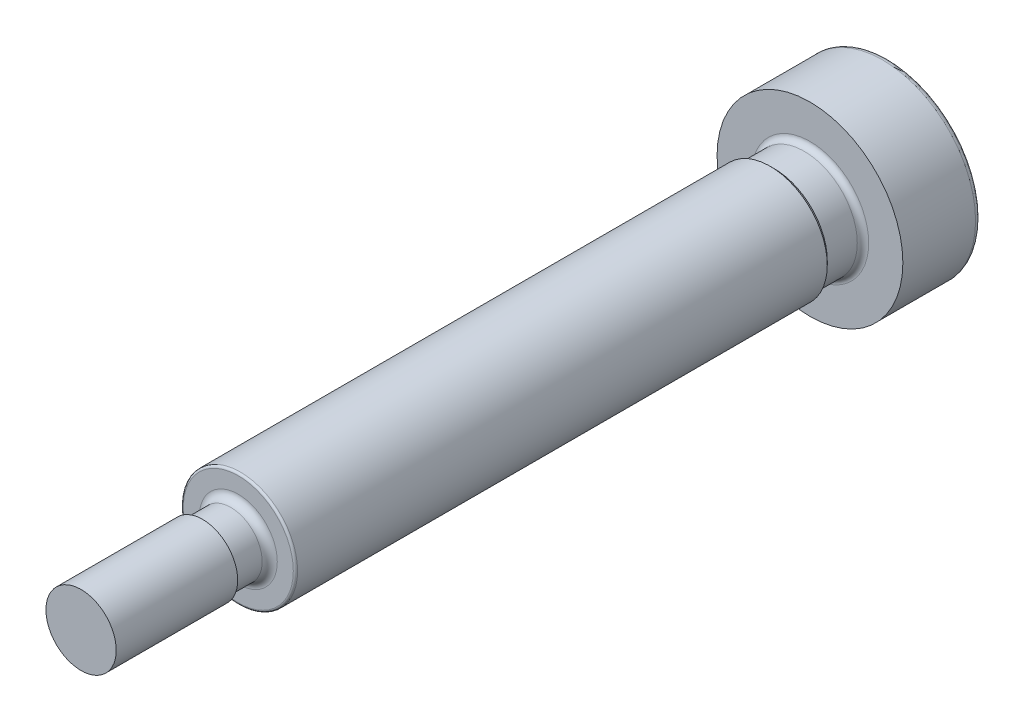
ISO-10303-21;
HEADER;
FILE_DESCRIPTION(('STEP AP214'),'2;1');
FILE_NAME('part.step','',(''),(''),'','','');
FILE_SCHEMA(('AUTOMOTIVE_DESIGN { 1 0 10303 214 1 1 1 1 }'));
ENDSEC;
DATA;
#1=APPLICATION_CONTEXT('core data for automotive mechanical design processes');
#2=APPLICATION_PROTOCOL_DEFINITION('international standard','automotive_design',2000,#1);
#3=PRODUCT_CONTEXT('',#1,'mechanical');
#4=PRODUCT('Part','Part','',(#3));
#5=PRODUCT_RELATED_PRODUCT_CATEGORY('part','',(#4));
#6=PRODUCT_DEFINITION_FORMATION('','',#4);
#7=PRODUCT_DEFINITION_CONTEXT('part definition',#1,'design');
#8=PRODUCT_DEFINITION('design','',#6,#7);
#9=PRODUCT_DEFINITION_SHAPE('','',#8);
#10=(LENGTH_UNIT() NAMED_UNIT(*) SI_UNIT(.MILLI.,.METRE.));
#11=(NAMED_UNIT(*) PLANE_ANGLE_UNIT() SI_UNIT($,.RADIAN.));
#12=(NAMED_UNIT(*) SI_UNIT($,.STERADIAN.) SOLID_ANGLE_UNIT());
#13=UNCERTAINTY_MEASURE_WITH_UNIT(LENGTH_MEASURE(1.E-05),#10,'distance_accuracy_value','');
#14=(GEOMETRIC_REPRESENTATION_CONTEXT(3) GLOBAL_UNCERTAINTY_ASSIGNED_CONTEXT((#13)) GLOBAL_UNIT_ASSIGNED_CONTEXT((#10,
#11,#12)) REPRESENTATION_CONTEXT('',''));
#15=CARTESIAN_POINT('',(0.,0.,0.));
#16=DIRECTION('',(0.,0.,1.));
#17=DIRECTION('',(1.,0.,0.));
#18=AXIS2_PLACEMENT_3D('',#15,#16,#17);
#19=CARTESIAN_POINT('',(0.,0.,-309.));
#20=DIRECTION('',(0.,0.,-1.));
#21=DIRECTION('',(0.,-1.,0.));
#22=AXIS2_PLACEMENT_3D('',#19,#20,#21);
#23=PLANE('',#22);
#24=CARTESIAN_POINT('',(0.,0.,-309.));
#25=DIRECTION('',(0.,0.,1.));
#26=DIRECTION('',(1.,0.,0.));
#27=AXIS2_PLACEMENT_3D('',#24,#25,#26);
#28=CIRCLE('',#27,2.458734122635);
#29=CARTESIAN_POINT('',(2.458734122635,0.,-309.));
#30=VERTEX_POINT('',#29);
#31=EDGE_CURVE('E11',#30,#30,#28,.T.);
#32=ORIENTED_EDGE('',*,*,#31,.T.);
#33=EDGE_LOOP('',(#32));
#34=FACE_BOUND('',#33,.T.);
#35=ADVANCED_FACE('F16',(#34),#23,.F.);
#36=CARTESIAN_POINT('',(0.,0.,-309.));
#37=DIRECTION('',(0.,0.,-1.));
#38=DIRECTION('',(1.,0.,0.));
#39=AXIS2_PLACEMENT_3D('',#36,#37,#38);
#40=CYLINDRICAL_SURFACE('',#39,2.458734122635);
#41=DIRECTION('',(0.,0.,-1.));
#42=VECTOR('',#41,1.);
#43=CARTESIAN_POINT('',(2.458734122635,0.,-309.));
#44=LINE('',#43,#42);
#45=CARTESIAN_POINT('',(2.458734122635,0.,-317.5));
#46=VERTEX_POINT('',#45);
#47=EDGE_CURVE('E26',#30,#46,#44,.T.);
#48=ORIENTED_EDGE('',*,*,#47,.F.);
#49=ORIENTED_EDGE('',*,*,#31,.F.);
#50=ORIENTED_EDGE('',*,*,#47,.T.);
#51=CARTESIAN_POINT('',(0.,0.,-317.5));
#52=DIRECTION('',(0.,0.,1.));
#53=DIRECTION('',(1.,0.,0.));
#54=AXIS2_PLACEMENT_3D('',#51,#52,#53);
#55=CIRCLE('',#54,2.458734122635);
#56=EDGE_CURVE('E221',#46,#46,#55,.T.);
#57=ORIENTED_EDGE('',*,*,#56,.T.);
#58=EDGE_LOOP('',(#48,#49,#50,#57));
#59=FACE_BOUND('',#58,.T.);
#60=ADVANCED_FACE('F472',(#59),#40,.T.);
#61=CARTESIAN_POINT('',(0.,0.,-317.5));
#62=DIRECTION('',(0.,0.,-1.));
#63=DIRECTION('',(0.,-1.,0.));
#64=AXIS2_PLACEMENT_3D('',#61,#62,#63);
#65=PLANE('',#64);
#66=CARTESIAN_POINT('',(0.,0.,-317.5));
#67=DIRECTION('',(0.,0.,1.));
#68=DIRECTION('',(1.,0.,0.));
#69=AXIS2_PLACEMENT_3D('',#66,#67,#68);
#70=CIRCLE('',#69,2.2);
#71=CARTESIAN_POINT('',(2.2,0.,-317.5));
#72=VERTEX_POINT('',#71);
#73=EDGE_CURVE('E19',#72,#72,#70,.T.);
#74=ORIENTED_EDGE('',*,*,#73,.T.);
#75=EDGE_LOOP('',(#74));
#76=FACE_BOUND('',#75,.T.);
#77=ORIENTED_EDGE('',*,*,#56,.F.);
#78=EDGE_LOOP('',(#77));
#79=FACE_BOUND('',#78,.T.);
#80=ADVANCED_FACE('F464',(#76,#79),#65,.T.);
#81=CARTESIAN_POINT('',(0.,0.,-320.));
#82=DIRECTION('',(0.,0.,1.));
#83=DIRECTION('',(1.,0.,0.));
#84=AXIS2_PLACEMENT_3D('',#81,#82,#83);
#85=CYLINDRICAL_SURFACE('',#84,2.2);
#86=CARTESIAN_POINT('',(0.,0.,-319.47));
#87=DIRECTION('',(0.,0.,1.));
#88=DIRECTION('',(1.,0.,0.));
#89=AXIS2_PLACEMENT_3D('',#86,#87,#88);
#90=CIRCLE('',#89,2.2);
#91=CARTESIAN_POINT('',(2.2,0.,-319.47));
#92=VERTEX_POINT('',#91);
#93=EDGE_CURVE('E289',#92,#92,#90,.T.);
#94=ORIENTED_EDGE('',*,*,#93,.T.);
#95=DIRECTION('',(0.,0.,1.));
#96=VECTOR('',#95,1.);
#97=CARTESIAN_POINT('',(2.2,0.,-320.));
#98=LINE('',#97,#96);
#99=EDGE_CURVE('E103',#92,#72,#98,.T.);
#100=ORIENTED_EDGE('',*,*,#99,.T.);
#101=ORIENTED_EDGE('',*,*,#73,.F.);
#102=ORIENTED_EDGE('',*,*,#99,.F.);
#103=EDGE_LOOP('',(#94,#100,#101,#102));
#104=FACE_BOUND('',#103,.T.);
#105=ADVANCED_FACE('F455',(#104),#85,.T.);
#106=CARTESIAN_POINT('',(0.,0.,-319.47));
#107=DIRECTION('',(0.,0.,1.));
#108=DIRECTION('',(1.,0.,0.));
#109=AXIS2_PLACEMENT_3D('',#106,#107,#108);
#110=TOROIDAL_SURFACE('',#109,2.73,0.53);
#111=CARTESIAN_POINT('',(2.73,0.,-319.47));
#112=DIRECTION('',(0.,-1.,0.));
#113=DIRECTION('',(-1.,0.,0.));
#114=AXIS2_PLACEMENT_3D('',#111,#112,#113);
#115=CIRCLE('',#114,0.53);
#116=CARTESIAN_POINT('',(2.73,0.,-320.));
#117=VERTEX_POINT('',#116);
#118=EDGE_CURVE('E286',#92,#117,#115,.T.);
#119=ORIENTED_EDGE('',*,*,#118,.T.);
#120=CARTESIAN_POINT('',(0.,0.,-320.));
#121=DIRECTION('',(0.,0.,1.));
#122=DIRECTION('',(1.,0.,0.));
#123=AXIS2_PLACEMENT_3D('',#120,#121,#122);
#124=CIRCLE('',#123,2.73);
#125=EDGE_CURVE('E290',#117,#117,#124,.T.);
#126=ORIENTED_EDGE('',*,*,#125,.T.);
#127=ORIENTED_EDGE('',*,*,#118,.F.);
#128=ORIENTED_EDGE('',*,*,#93,.F.);
#129=EDGE_LOOP('',(#119,#126,#127,#128));
#130=FACE_BOUND('',#129,.T.);
#131=ADVANCED_FACE('F446',(#130),#110,.F.);
#132=CARTESIAN_POINT('',(0.,0.,-320.));
#133=DIRECTION('',(0.,0.,-1.));
#134=DIRECTION('',(0.,-1.,0.));
#135=AXIS2_PLACEMENT_3D('',#132,#133,#134);
#136=PLANE('',#135);
#137=ORIENTED_EDGE('',*,*,#125,.F.);
#138=EDGE_LOOP('',(#137));
#139=FACE_BOUND('',#138,.T.);
#140=CARTESIAN_POINT('',(0.,0.,-320.));
#141=DIRECTION('',(0.,0.,1.));
#142=DIRECTION('',(1.,0.,0.));
#143=AXIS2_PLACEMENT_3D('',#140,#141,#142);
#144=CIRCLE('',#143,3.85);
#145=CARTESIAN_POINT('',(3.85,0.,-320.));
#146=VERTEX_POINT('',#145);
#147=EDGE_CURVE('E285',#146,#146,#144,.T.);
#148=ORIENTED_EDGE('',*,*,#147,.T.);
#149=EDGE_LOOP('',(#148));
#150=FACE_BOUND('',#149,.T.);
#151=ADVANCED_FACE('F437',(#139,#150),#136,.F.);
#152=CARTESIAN_POINT('',(0.,0.,-320.15));
#153=DIRECTION('',(0.,0.,1.));
#154=DIRECTION('',(1.,0.,0.));
#155=AXIS2_PLACEMENT_3D('',#152,#153,#154);
#156=TOROIDAL_SURFACE('',#155,3.85,0.15);
#157=CARTESIAN_POINT('',(0.,0.,-320.15));
#158=DIRECTION('',(0.,0.,1.));
#159=DIRECTION('',(1.,0.,0.));
#160=AXIS2_PLACEMENT_3D('',#157,#158,#159);
#161=CIRCLE('',#160,4.);
#162=CARTESIAN_POINT('',(4.,0.,-320.15));
#163=VERTEX_POINT('',#162);
#164=EDGE_CURVE('E277',#163,#163,#161,.T.);
#165=ORIENTED_EDGE('',*,*,#164,.T.);
#166=CARTESIAN_POINT('',(3.85,0.,-320.15));
#167=DIRECTION('',(0.,-1.,0.));
#168=DIRECTION('',(-1.,0.,0.));
#169=AXIS2_PLACEMENT_3D('',#166,#167,#168);
#170=CIRCLE('',#169,0.15);
#171=EDGE_CURVE('E280',#163,#146,#170,.T.);
#172=ORIENTED_EDGE('',*,*,#171,.T.);
#173=ORIENTED_EDGE('',*,*,#147,.F.);
#174=ORIENTED_EDGE('',*,*,#171,.F.);
#175=EDGE_LOOP('',(#165,#172,#173,#174));
#176=FACE_BOUND('',#175,.T.);
#177=ADVANCED_FACE('F428',(#176),#156,.T.);
#178=CARTESIAN_POINT('',(2.309401076759,0.,-362.2));
#179=DIRECTION('',(0.,0.,1.));
#180=DIRECTION('',(0.,-1.,0.));
#181=AXIS2_PLACEMENT_3D('',#178,#179,#180);
#182=PLANE('',#181);
#183=DIRECTION('',(0.50000000000019,0.866025403784329,0.));
#184=VECTOR('',#183,1.);
#185=CARTESIAN_POINT('',(1.154700538379,-2.,-362.2));
#186=LINE('',#185,#184);
#187=CARTESIAN_POINT('',(1.154700538379,-2.,-362.2));
#188=VERTEX_POINT('',#187);
#189=CARTESIAN_POINT('',(2.309401076759,0.,-362.2));
#190=VERTEX_POINT('',#189);
#191=EDGE_CURVE('E136',#188,#190,#186,.T.);
#192=ORIENTED_EDGE('',*,*,#191,.F.);
#193=DIRECTION('',(1.,0.,0.));
#194=VECTOR('',#193,1.);
#195=CARTESIAN_POINT('',(-1.154700538379,-2.,-362.2));
#196=LINE('',#195,#194);
#197=CARTESIAN_POINT('',(-1.154700538379,-2.,-362.2));
#198=VERTEX_POINT('',#197);
#199=EDGE_CURVE('E130',#198,#188,#196,.T.);
#200=ORIENTED_EDGE('',*,*,#199,.F.);
#201=DIRECTION('',(0.50000000000019,-0.866025403784329,0.));
#202=VECTOR('',#201,1.);
#203=CARTESIAN_POINT('',(-2.309401076759,0.,-362.2));
#204=LINE('',#203,#202);
#205=CARTESIAN_POINT('',(-2.309401076759,0.,-362.2));
#206=VERTEX_POINT('',#205);
#207=EDGE_CURVE('E212',#206,#198,#204,.T.);
#208=ORIENTED_EDGE('',*,*,#207,.F.);
#209=DIRECTION('',(-0.50000000000019,-0.866025403784329,0.));
#210=VECTOR('',#209,1.);
#211=CARTESIAN_POINT('',(-1.154700538379,2.,-362.2));
#212=LINE('',#211,#210);
#213=CARTESIAN_POINT('',(-1.154700538379,2.,-362.2));
#214=VERTEX_POINT('',#213);
#215=EDGE_CURVE('E254',#214,#206,#212,.T.);
#216=ORIENTED_EDGE('',*,*,#215,.F.);
#217=DIRECTION('',(-1.,0.,0.));
#218=VECTOR('',#217,1.);
#219=CARTESIAN_POINT('',(1.154700538379,2.,-362.2));
#220=LINE('',#219,#218);
#221=CARTESIAN_POINT('',(1.154700538379,2.,-362.2));
#222=VERTEX_POINT('',#221);
#223=EDGE_CURVE('E266',#222,#214,#220,.T.);
#224=ORIENTED_EDGE('',*,*,#223,.F.);
#225=DIRECTION('',(-0.50000000000019,0.866025403784329,0.));
#226=VECTOR('',#225,1.);
#227=CARTESIAN_POINT('',(2.309401076759,0.,-362.2));
#228=LINE('',#227,#226);
#229=EDGE_CURVE('E272',#190,#222,#228,.T.);
#230=ORIENTED_EDGE('',*,*,#229,.F.);
#231=EDGE_LOOP('',(#192,#200,#208,#216,#224,#230));
#232=FACE_BOUND('',#231,.T.);
#233=ADVANCED_FACE('F419',(#232),#182,.F.);
#234=CARTESIAN_POINT('',(0.,0.,-357.21));
#235=DIRECTION('',(0.,0.,1.));
#236=DIRECTION('',(1.,0.,0.));
#237=AXIS2_PLACEMENT_3D('',#234,#235,#236);
#238=CYLINDRICAL_SURFACE('',#237,4.);
#239=CARTESIAN_POINT('',(0.,0.,-357.21));
#240=DIRECTION('',(0.,0.,1.));
#241=DIRECTION('',(1.,0.,0.));
#242=AXIS2_PLACEMENT_3D('',#239,#240,#241);
#243=CIRCLE('',#242,4.);
#244=CARTESIAN_POINT('',(4.,0.,-357.21));
#245=VERTEX_POINT('',#244);
#246=EDGE_CURVE('E137',#245,#245,#243,.T.);
#247=ORIENTED_EDGE('',*,*,#246,.T.);
#248=DIRECTION('',(0.,0.,1.));
#249=VECTOR('',#248,1.);
#250=CARTESIAN_POINT('',(4.,0.,-357.21));
#251=LINE('',#250,#249);
#252=EDGE_CURVE('E273',#245,#163,#251,.T.);
#253=ORIENTED_EDGE('',*,*,#252,.T.);
#254=ORIENTED_EDGE('',*,*,#164,.F.);
#255=ORIENTED_EDGE('',*,*,#252,.F.);
#256=EDGE_LOOP('',(#247,#253,#254,#255));
#257=FACE_BOUND('',#256,.T.);
#258=ADVANCED_FACE('F410',(#257),#238,.T.);
#259=CARTESIAN_POINT('',(2.309401076759,0.,-362.2));
#260=DIRECTION('',(-0.866025403784329,-0.50000000000019,0.));
#261=DIRECTION('',(-0.50000000000019,0.866025403784329,0.));
#262=AXIS2_PLACEMENT_3D('',#259,#260,#261);
#263=PLANE('',#262);
#264=CARTESIAN_POINT('',(2.309401076759,0.,-365.5));
#265=CARTESIAN_POINT('',(2.309401076759,0.,-362.2));
#266=(BOUNDED_CURVE() B_SPLINE_CURVE(1,(#264,#265),.UNSPECIFIED.,.F.,
.F.) B_SPLINE_CURVE_WITH_KNOTS((2,2),(0.,1.),
.UNSPECIFIED.) CURVE() GEOMETRIC_REPRESENTATION_ITEM() RATIONAL_B_SPLINE_CURVE((1.,1.)) REPRESENTATION_ITEM(''));
#267=CARTESIAN_POINT('',(2.309401076759,0.,-365.5));
#268=VERTEX_POINT('',#267);
#269=EDGE_CURVE('E153',#268,#190,#266,.T.);
#270=ORIENTED_EDGE('',*,*,#269,.T.);
#271=ORIENTED_EDGE('',*,*,#229,.T.);
#272=CARTESIAN_POINT('',(1.154700538379,2.,-365.5));
#273=CARTESIAN_POINT('',(1.154700538379,2.,-362.2));
#274=(BOUNDED_CURVE() B_SPLINE_CURVE(1,(#272,#273),.UNSPECIFIED.,.F.,
.F.) B_SPLINE_CURVE_WITH_KNOTS((2,2),(0.,1.),
.UNSPECIFIED.) CURVE() GEOMETRIC_REPRESENTATION_ITEM() RATIONAL_B_SPLINE_CURVE((1.,1.)) REPRESENTATION_ITEM(''));
#275=CARTESIAN_POINT('',(1.154700538379,2.,-365.5));
#276=VERTEX_POINT('',#275);
#277=EDGE_CURVE('E260',#276,#222,#274,.T.);
#278=ORIENTED_EDGE('',*,*,#277,.F.);
#279=DIRECTION('',(-0.50000000000019,0.866025403784329,0.));
#280=VECTOR('',#279,1.);
#281=CARTESIAN_POINT('',(2.309401076759,0.,-365.5));
#282=LINE('',#281,#280);
#283=EDGE_CURVE('E156',#268,#276,#282,.T.);
#284=ORIENTED_EDGE('',*,*,#283,.F.);
#285=EDGE_LOOP('',(#270,#271,#278,#284));
#286=FACE_BOUND('',#285,.T.);
#287=ADVANCED_FACE('F401',(#286),#263,.T.);
#288=CARTESIAN_POINT('',(1.154700538379,2.,-362.2));
#289=DIRECTION('',(0.,-1.,0.));
#290=DIRECTION('',(-1.,0.,0.));
#291=AXIS2_PLACEMENT_3D('',#288,#289,#290);
#292=PLANE('',#291);
#293=ORIENTED_EDGE('',*,*,#277,.T.);
#294=ORIENTED_EDGE('',*,*,#223,.T.);
#295=CARTESIAN_POINT('',(-1.154700538379,2.,-365.5));
#296=CARTESIAN_POINT('',(-1.154700538379,2.,-362.2));
#297=(BOUNDED_CURVE() B_SPLINE_CURVE(1,(#295,#296),.UNSPECIFIED.,.F.,
.F.) B_SPLINE_CURVE_WITH_KNOTS((2,2),(0.,1.),
.UNSPECIFIED.) CURVE() GEOMETRIC_REPRESENTATION_ITEM() RATIONAL_B_SPLINE_CURVE((1.,1.)) REPRESENTATION_ITEM(''));
#298=CARTESIAN_POINT('',(-1.154700538379,2.,-365.5));
#299=VERTEX_POINT('',#298);
#300=EDGE_CURVE('E215',#299,#214,#297,.T.);
#301=ORIENTED_EDGE('',*,*,#300,.F.);
#302=DIRECTION('',(-1.,0.,0.));
#303=VECTOR('',#302,1.);
#304=CARTESIAN_POINT('',(1.154700538379,2.,-365.5));
#305=LINE('',#304,#303);
#306=EDGE_CURVE('E163',#276,#299,#305,.T.);
#307=ORIENTED_EDGE('',*,*,#306,.F.);
#308=EDGE_LOOP('',(#293,#294,#301,#307));
#309=FACE_BOUND('',#308,.T.);
#310=ADVANCED_FACE('F384',(#309),#292,.T.);
#311=CARTESIAN_POINT('',(-1.154700538379,2.,-362.2));
#312=DIRECTION('',(0.866025403784329,-0.50000000000019,0.));
#313=DIRECTION('',(0.,0.,-1.));
#314=AXIS2_PLACEMENT_3D('',#311,#312,#313);
#315=PLANE('',#314);
#316=ORIENTED_EDGE('',*,*,#300,.T.);
#317=ORIENTED_EDGE('',*,*,#215,.T.);
#318=CARTESIAN_POINT('',(-2.309401076759,0.,-365.5));
#319=CARTESIAN_POINT('',(-2.309401076759,0.,-362.2));
#320=(BOUNDED_CURVE() B_SPLINE_CURVE(1,(#318,#319),.UNSPECIFIED.,.F.,
.F.) B_SPLINE_CURVE_WITH_KNOTS((2,2),(0.,1.),
.UNSPECIFIED.) CURVE() GEOMETRIC_REPRESENTATION_ITEM() RATIONAL_B_SPLINE_CURVE((1.,1.)) REPRESENTATION_ITEM(''));
#321=CARTESIAN_POINT('',(-2.309401076759,0.,-365.5));
#322=VERTEX_POINT('',#321);
#323=EDGE_CURVE('E216',#322,#206,#320,.T.);
#324=ORIENTED_EDGE('',*,*,#323,.F.);
#325=DIRECTION('',(-0.50000000000019,-0.866025403784329,0.));
#326=VECTOR('',#325,1.);
#327=CARTESIAN_POINT('',(-1.154700538379,2.,-365.5));
#328=LINE('',#327,#326);
#329=EDGE_CURVE('E188',#299,#322,#328,.T.);
#330=ORIENTED_EDGE('',*,*,#329,.F.);
#331=EDGE_LOOP('',(#316,#317,#324,#330));
#332=FACE_BOUND('',#331,.T.);
#333=ADVANCED_FACE('F380',(#332),#315,.T.);
#334=CARTESIAN_POINT('',(-2.309401076759,0.,-362.2));
#335=DIRECTION('',(0.866025403784329,0.50000000000019,0.));
#336=DIRECTION('',(0.,0.,-1.));
#337=AXIS2_PLACEMENT_3D('',#334,#335,#336);
#338=PLANE('',#337);
#339=ORIENTED_EDGE('',*,*,#323,.T.);
#340=ORIENTED_EDGE('',*,*,#207,.T.);
#341=CARTESIAN_POINT('',(-1.154700538379,-2.,-365.5));
#342=CARTESIAN_POINT('',(-1.154700538379,-2.,-362.2));
#343=(BOUNDED_CURVE() B_SPLINE_CURVE(1,(#341,#342),.UNSPECIFIED.,.F.,
.F.) B_SPLINE_CURVE_WITH_KNOTS((2,2),(0.,1.),
.UNSPECIFIED.) CURVE() GEOMETRIC_REPRESENTATION_ITEM() RATIONAL_B_SPLINE_CURVE((1.,1.)) REPRESENTATION_ITEM(''));
#344=CARTESIAN_POINT('',(-1.154700538379,-2.,-365.5));
#345=VERTEX_POINT('',#344);
#346=EDGE_CURVE('E177',#345,#198,#343,.T.);
#347=ORIENTED_EDGE('',*,*,#346,.F.);
#348=DIRECTION('',(0.50000000000019,-0.866025403784329,0.));
#349=VECTOR('',#348,1.);
#350=CARTESIAN_POINT('',(-2.309401076759,0.,-365.5));
#351=LINE('',#350,#349);
#352=EDGE_CURVE('E147',#322,#345,#351,.T.);
#353=ORIENTED_EDGE('',*,*,#352,.F.);
#354=EDGE_LOOP('',(#339,#340,#347,#353));
#355=FACE_BOUND('',#354,.T.);
#356=ADVANCED_FACE('F344',(#355),#338,.T.);
#357=CARTESIAN_POINT('',(-1.154700538379,-2.,-362.2));
#358=DIRECTION('',(0.,1.,0.));
#359=DIRECTION('',(0.,0.,-1.));
#360=AXIS2_PLACEMENT_3D('',#357,#358,#359);
#361=PLANE('',#360);
#362=ORIENTED_EDGE('',*,*,#346,.T.);
#363=ORIENTED_EDGE('',*,*,#199,.T.);
#364=CARTESIAN_POINT('',(1.154700538379,-2.,-365.5));
#365=CARTESIAN_POINT('',(1.154700538379,-2.,-362.2));
#366=(BOUNDED_CURVE() B_SPLINE_CURVE(1,(#364,#365),.UNSPECIFIED.,.F.,
.F.) B_SPLINE_CURVE_WITH_KNOTS((2,2),(0.,1.),
.UNSPECIFIED.) CURVE() GEOMETRIC_REPRESENTATION_ITEM() RATIONAL_B_SPLINE_CURVE((1.,1.)) REPRESENTATION_ITEM(''));
#367=CARTESIAN_POINT('',(1.154700538379,-2.,-365.5));
#368=VERTEX_POINT('',#367);
#369=EDGE_CURVE('E123',#368,#188,#366,.T.);
#370=ORIENTED_EDGE('',*,*,#369,.F.);
#371=DIRECTION('',(1.,0.,0.));
#372=VECTOR('',#371,1.);
#373=CARTESIAN_POINT('',(-1.154700538379,-2.,-365.5));
#374=LINE('',#373,#372);
#375=EDGE_CURVE('E127',#345,#368,#374,.T.);
#376=ORIENTED_EDGE('',*,*,#375,.F.);
#377=EDGE_LOOP('',(#362,#363,#370,#376));
#378=FACE_BOUND('',#377,.T.);
#379=ADVANCED_FACE('F126',(#378),#361,.T.);
#380=CARTESIAN_POINT('',(1.154700538379,-2.,-362.2));
#381=DIRECTION('',(-0.866025403784329,0.50000000000019,0.));
#382=DIRECTION('',(0.,0.,1.));
#383=AXIS2_PLACEMENT_3D('',#380,#381,#382);
#384=PLANE('',#383);
#385=ORIENTED_EDGE('',*,*,#369,.T.);
#386=ORIENTED_EDGE('',*,*,#191,.T.);
#387=ORIENTED_EDGE('',*,*,#269,.F.);
#388=DIRECTION('',(0.50000000000019,0.866025403784329,0.));
#389=VECTOR('',#388,1.);
#390=CARTESIAN_POINT('',(1.154700538379,-2.,-365.5));
#391=LINE('',#390,#389);
#392=EDGE_CURVE('E144',#368,#268,#391,.T.);
#393=ORIENTED_EDGE('',*,*,#392,.F.);
#394=EDGE_LOOP('',(#385,#386,#387,#393));
#395=FACE_BOUND('',#394,.T.);
#396=ADVANCED_FACE('F151',(#395),#384,.T.);
#397=CARTESIAN_POINT('',(0.,0.,-357.5));
#398=DIRECTION('',(0.,0.,1.));
#399=DIRECTION('',(1.,0.,0.));
#400=AXIS2_PLACEMENT_3D('',#397,#398,#399);
#401=CONICAL_SURFACE('',#400,3.71,0.785398163397);
#402=CARTESIAN_POINT('',(0.,0.,-357.5));
#403=DIRECTION('',(0.,0.,1.));
#404=DIRECTION('',(1.,0.,0.));
#405=AXIS2_PLACEMENT_3D('',#402,#403,#404);
#406=CIRCLE('',#405,3.71);
#407=CARTESIAN_POINT('',(3.71,0.,-357.5));
#408=VERTEX_POINT('',#407);
#409=EDGE_CURVE('E157',#408,#408,#406,.T.);
#410=ORIENTED_EDGE('',*,*,#409,.T.);
#411=DIRECTION('',(0.707106781186548,0.,0.707106781186548));
#412=VECTOR('',#411,1.);
#413=CARTESIAN_POINT('',(3.71,0.,-357.5));
#414=LINE('',#413,#412);
#415=EDGE_CURVE('E149',#408,#245,#414,.T.);
#416=ORIENTED_EDGE('',*,*,#415,.T.);
#417=ORIENTED_EDGE('',*,*,#246,.F.);
#418=ORIENTED_EDGE('',*,*,#415,.F.);
#419=EDGE_LOOP('',(#410,#416,#417,#418));
#420=FACE_BOUND('',#419,.T.);
#421=ADVANCED_FACE('F352',(#420),#401,.T.);
#422=CARTESIAN_POINT('',(0.,0.,-365.5));
#423=DIRECTION('',(0.,0.,-1.));
#424=DIRECTION('',(0.,-1.,0.));
#425=AXIS2_PLACEMENT_3D('',#422,#423,#424);
#426=PLANE('',#425);
#427=ORIENTED_EDGE('',*,*,#392,.T.);
#428=ORIENTED_EDGE('',*,*,#283,.T.);
#429=ORIENTED_EDGE('',*,*,#306,.T.);
#430=ORIENTED_EDGE('',*,*,#329,.T.);
#431=ORIENTED_EDGE('',*,*,#352,.T.);
#432=ORIENTED_EDGE('',*,*,#375,.T.);
#433=EDGE_LOOP('',(#427,#428,#429,#430,#431,#432));
#434=FACE_BOUND('',#433,.T.);
#435=CARTESIAN_POINT('',(0.,0.,-365.5));
#436=DIRECTION('',(0.,0.,1.));
#437=DIRECTION('',(1.,0.,0.));
#438=AXIS2_PLACEMENT_3D('',#435,#436,#437);
#439=CIRCLE('',#438,6.0875);
#440=CARTESIAN_POINT('',(6.0875,0.,-365.5));
#441=VERTEX_POINT('',#440);
#442=EDGE_CURVE('E200',#441,#441,#439,.T.);
#443=ORIENTED_EDGE('',*,*,#442,.F.);
#444=EDGE_LOOP('',(#443));
#445=FACE_BOUND('',#444,.T.);
#446=ADVANCED_FACE('F141',(#434,#445),#426,.T.);
#447=CARTESIAN_POINT('',(0.,0.,-360.));
#448=DIRECTION('',(0.,0.,1.));
#449=DIRECTION('',(1.,0.,0.));
#450=AXIS2_PLACEMENT_3D('',#447,#448,#449);
#451=CYLINDRICAL_SURFACE('',#450,3.71);
#452=CARTESIAN_POINT('',(0.,0.,-359.6));
#453=DIRECTION('',(0.,0.,1.));
#454=DIRECTION('',(1.,0.,0.));
#455=AXIS2_PLACEMENT_3D('',#452,#453,#454);
#456=CIRCLE('',#455,3.71);
#457=CARTESIAN_POINT('',(3.71,0.,-359.6));
#458=VERTEX_POINT('',#457);
#459=EDGE_CURVE('E192',#458,#458,#456,.T.);
#460=ORIENTED_EDGE('',*,*,#459,.T.);
#461=DIRECTION('',(0.,0.,1.));
#462=VECTOR('',#461,1.);
#463=CARTESIAN_POINT('',(3.71,0.,-360.));
#464=LINE('',#463,#462);
#465=EDGE_CURVE('E167',#458,#408,#464,.T.);
#466=ORIENTED_EDGE('',*,*,#465,.T.);
#467=ORIENTED_EDGE('',*,*,#409,.F.);
#468=ORIENTED_EDGE('',*,*,#465,.F.);
#469=EDGE_LOOP('',(#460,#466,#467,#468));
#470=FACE_BOUND('',#469,.T.);
#471=ADVANCED_FACE('F335',(#470),#451,.T.);
#472=CARTESIAN_POINT('',(0.,0.,-365.0875));
#473=DIRECTION('',(0.,0.,-1.));
#474=DIRECTION('',(1.,0.,0.));
#475=AXIS2_PLACEMENT_3D('',#472,#473,#474);
#476=TOROIDAL_SURFACE('',#475,6.0875,0.4125);
#477=CARTESIAN_POINT('',(6.0875,0.,-365.0875));
#478=DIRECTION('',(0.,1.,0.));
#479=DIRECTION('',(1.,0.,0.));
#480=AXIS2_PLACEMENT_3D('',#477,#478,#479);
#481=CIRCLE('',#480,0.4125);
#482=CARTESIAN_POINT('',(6.5,0.,-365.0875));
#483=VERTEX_POINT('',#482);
#484=EDGE_CURVE('E196',#483,#441,#481,.T.);
#485=ORIENTED_EDGE('',*,*,#484,.T.);
#486=ORIENTED_EDGE('',*,*,#442,.T.);
#487=ORIENTED_EDGE('',*,*,#484,.F.);
#488=CARTESIAN_POINT('',(0.,0.,-365.0875));
#489=DIRECTION('',(0.,0.,1.));
#490=DIRECTION('',(1.,0.,0.));
#491=AXIS2_PLACEMENT_3D('',#488,#489,#490);
#492=CIRCLE('',#491,6.5);
#493=EDGE_CURVE('E173',#483,#483,#492,.T.);
#494=ORIENTED_EDGE('',*,*,#493,.F.);
#495=EDGE_LOOP('',(#485,#486,#487,#494));
#496=FACE_BOUND('',#495,.T.);
#497=ADVANCED_FACE('F326',(#496),#476,.T.);
#498=CARTESIAN_POINT('',(0.,0.,-359.6));
#499=DIRECTION('',(0.,0.,1.));
#500=DIRECTION('',(1.,0.,0.));
#501=AXIS2_PLACEMENT_3D('',#498,#499,#500);
#502=TOROIDAL_SURFACE('',#501,4.11,0.4);
#503=CARTESIAN_POINT('',(4.11,0.,-359.6));
#504=DIRECTION('',(0.,-1.,0.));
#505=DIRECTION('',(-1.,0.,0.));
#506=AXIS2_PLACEMENT_3D('',#503,#504,#505);
#507=CIRCLE('',#506,0.4);
#508=CARTESIAN_POINT('',(4.11,0.,-360.));
#509=VERTEX_POINT('',#508);
#510=EDGE_CURVE('E176',#458,#509,#507,.T.);
#511=ORIENTED_EDGE('',*,*,#510,.T.);
#512=CARTESIAN_POINT('',(0.,0.,-360.));
#513=DIRECTION('',(0.,0.,1.));
#514=DIRECTION('',(1.,0.,0.));
#515=AXIS2_PLACEMENT_3D('',#512,#513,#514);
#516=CIRCLE('',#515,4.11);
#517=EDGE_CURVE('E517',#509,#509,#516,.T.);
#518=ORIENTED_EDGE('',*,*,#517,.T.);
#519=ORIENTED_EDGE('',*,*,#510,.F.);
#520=ORIENTED_EDGE('',*,*,#459,.F.);
#521=EDGE_LOOP('',(#511,#518,#519,#520));
#522=FACE_BOUND('',#521,.T.);
#523=ADVANCED_FACE('F317',(#522),#502,.F.);
#524=CARTESIAN_POINT('',(0.,0.,-362.75));
#525=DIRECTION('',(0.,0.,-1.));
#526=DIRECTION('',(1.,0.,0.));
#527=AXIS2_PLACEMENT_3D('',#524,#525,#526);
#528=CYLINDRICAL_SURFACE('',#527,6.5);
#529=DIRECTION('',(0.,0.,-1.));
#530=VECTOR('',#529,1.);
#531=CARTESIAN_POINT('',(6.5,0.,-362.75));
#532=LINE('',#531,#530);
#533=CARTESIAN_POINT('',(6.5,0.,-360.));
#534=VERTEX_POINT('',#533);
#535=EDGE_CURVE('E171',#534,#483,#532,.T.);
#536=ORIENTED_EDGE('',*,*,#535,.T.);
#537=ORIENTED_EDGE('',*,*,#493,.T.);
#538=ORIENTED_EDGE('',*,*,#535,.F.);
#539=CARTESIAN_POINT('',(0.,0.,-360.));
#540=DIRECTION('',(0.,0.,1.));
#541=DIRECTION('',(1.,0.,0.));
#542=AXIS2_PLACEMENT_3D('',#539,#540,#541);
#543=CIRCLE('',#542,6.5);
#544=EDGE_CURVE('E516',#534,#534,#543,.T.);
#545=ORIENTED_EDGE('',*,*,#544,.F.);
#546=EDGE_LOOP('',(#536,#537,#538,#545));
#547=FACE_BOUND('',#546,.T.);
#548=ADVANCED_FACE('F307',(#547),#528,.T.);
#549=CARTESIAN_POINT('',(0.,0.,-360.));
#550=DIRECTION('',(0.,0.,-1.));
#551=DIRECTION('',(0.,-1.,0.));
#552=AXIS2_PLACEMENT_3D('',#549,#550,#551);
#553=PLANE('',#552);
#554=ORIENTED_EDGE('',*,*,#517,.F.);
#555=EDGE_LOOP('',(#554));
#556=FACE_BOUND('',#555,.T.);
#557=ORIENTED_EDGE('',*,*,#544,.T.);
#558=EDGE_LOOP('',(#557));
#559=FACE_BOUND('',#558,.T.);
#560=ADVANCED_FACE('F302',(#556,#559),#553,.F.);
#561=CLOSED_SHELL('',(#35,#60,#80,#105,#131,#151,#177,#233,#258,#287,#310,#333,#356,#379,#396,
#421,#446,#471,#497,#523,#548,#560));
#562=MANIFOLD_SOLID_BREP('B1',#561);
#563=ADVANCED_BREP_SHAPE_REPRESENTATION('',(#18,#562),#14);
#564=SHAPE_DEFINITION_REPRESENTATION(#9,#563);
ENDSEC;
END-ISO-10303-21;
